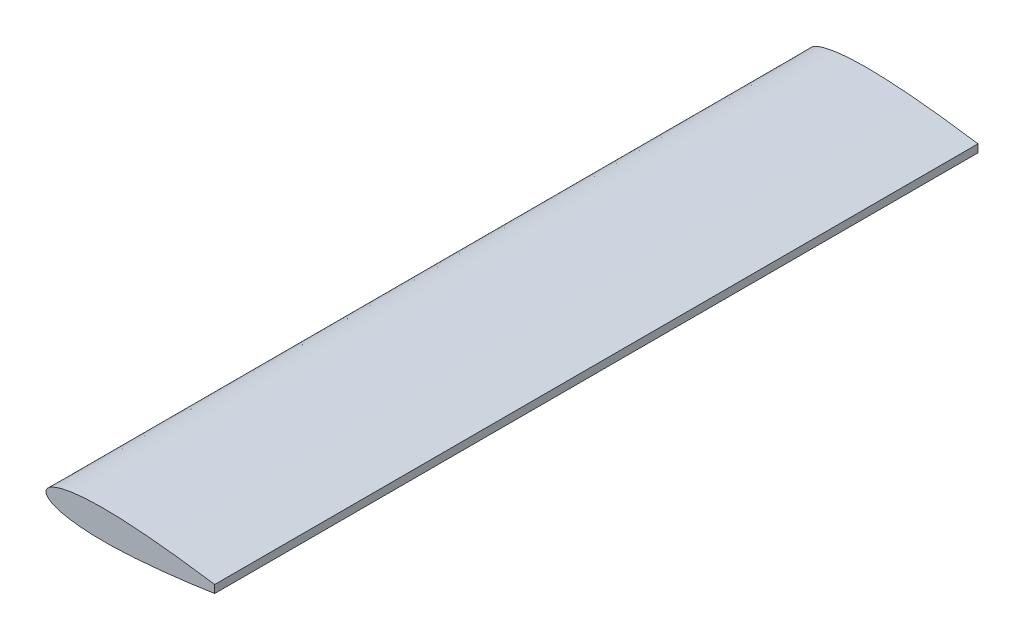
ISO-10303-21;
HEADER;
FILE_DESCRIPTION(('STEP AP214'),'2;1');
FILE_NAME('part.step','',(''),(''),'','','');
FILE_SCHEMA(('AUTOMOTIVE_DESIGN { 1 0 10303 214 1 1 1 1 }'));
ENDSEC;
DATA;
#1=APPLICATION_CONTEXT('core data for automotive mechanical design processes');
#2=APPLICATION_PROTOCOL_DEFINITION('international standard','automotive_design',2000,#1);
#3=PRODUCT_CONTEXT('',#1,'mechanical');
#4=PRODUCT('Part','Part','',(#3));
#5=PRODUCT_RELATED_PRODUCT_CATEGORY('part','',(#4));
#6=PRODUCT_DEFINITION_FORMATION('','',#4);
#7=PRODUCT_DEFINITION_CONTEXT('part definition',#1,'design');
#8=PRODUCT_DEFINITION('design','',#6,#7);
#9=PRODUCT_DEFINITION_SHAPE('','',#8);
#10=(LENGTH_UNIT() NAMED_UNIT(*) SI_UNIT(.MILLI.,.METRE.));
#11=(NAMED_UNIT(*) PLANE_ANGLE_UNIT() SI_UNIT($,.RADIAN.));
#12=(NAMED_UNIT(*) SI_UNIT($,.STERADIAN.) SOLID_ANGLE_UNIT());
#13=UNCERTAINTY_MEASURE_WITH_UNIT(LENGTH_MEASURE(1.E-05),#10,'distance_accuracy_value','');
#14=(GEOMETRIC_REPRESENTATION_CONTEXT(3) GLOBAL_UNCERTAINTY_ASSIGNED_CONTEXT((#13)) GLOBAL_UNIT_ASSIGNED_CONTEXT((#10,
#11,#12)) REPRESENTATION_CONTEXT('',''));
#15=CARTESIAN_POINT('',(0.,0.,0.));
#16=DIRECTION('',(0.,0.,1.));
#17=DIRECTION('',(1.,0.,0.));
#18=AXIS2_PLACEMENT_3D('',#15,#16,#17);
#19=CARTESIAN_POINT('',(87.3951206200439,0.235968611206823,302.));
#20=CARTESIAN_POINT('',(84.8959486887418,0.665928684584799,302.));
#21=CARTESIAN_POINT('',(79.9014599588763,1.52518559039502,302.));
#22=CARTESIAN_POINT('',(69.9066248700965,3.12260599284425,302.));
#23=CARTESIAN_POINT('',(57.4121462912735,4.95644683175647,302.));
#24=CARTESIAN_POINT('',(42.4108902125652,6.91018624900826,302.));
#25=CARTESIAN_POINT('',(27.4110875983502,8.60493051246451,302.));
#26=CARTESIAN_POINT('',(12.4111218015999,9.9900862046659,302.));
#27=CARTESIAN_POINT('',(-2.59122205177352,10.9741165457677,302.));
#28=CARTESIAN_POINT('',(-15.103442931041,11.3205115879112,302.));
#29=CARTESIAN_POINT('',(-25.1091053186778,11.1840759605762,302.));
#30=CARTESIAN_POINT('',(-32.6174923002774,10.8130196983056,302.));
#31=CARTESIAN_POINT('',(-40.1361668292086,10.0990192916365,302.));
#32=CARTESIAN_POINT('',(-46.395675990857,9.0993918778158,302.));
#33=CARTESIAN_POINT('',(-51.3947099630212,7.91075511271777,302.));
#34=CARTESIAN_POINT('',(-55.1903231052005,6.71878656562906,302.));
#35=CARTESIAN_POINT('',(-58.3812550074555,5.27210938350864,302.));
#36=CARTESIAN_POINT('',(-61.2455994913682,3.35780382880287,302.));
#37=CARTESIAN_POINT('',(-63.467561430567,-0.00103138879315032,302.));
#38=CARTESIAN_POINT('',(-61.2455994913682,-3.35986660638926,302.));
#39=CARTESIAN_POINT('',(-58.3812550074556,-5.27417216109497,302.));
#40=CARTESIAN_POINT('',(-55.1903231052005,-6.72084934321543,302.));
#41=CARTESIAN_POINT('',(-51.3947099630213,-7.91281789030411,302.));
#42=CARTESIAN_POINT('',(-46.395675990857,-9.10145465540217,302.));
#43=CARTESIAN_POINT('',(-40.1361668292086,-10.1010820692228,302.));
#44=CARTESIAN_POINT('',(-32.6174923002774,-10.8150824758919,302.));
#45=CARTESIAN_POINT('',(-25.1091053186778,-11.1861387381625,302.));
#46=CARTESIAN_POINT('',(-15.103442931041,-11.3225743654975,302.));
#47=CARTESIAN_POINT('',(-2.59122205177352,-10.976179323354,302.));
#48=CARTESIAN_POINT('',(12.4111218015999,-9.99214898225225,302.));
#49=CARTESIAN_POINT('',(27.4110875983503,-8.60699329005087,302.));
#50=CARTESIAN_POINT('',(42.4108902125652,-6.91224902659461,302.));
#51=CARTESIAN_POINT('',(57.4121462912735,-4.95850960934283,302.));
#52=CARTESIAN_POINT('',(69.9066248700965,-3.12466877043061,302.));
#53=CARTESIAN_POINT('',(79.9014599588764,-1.52724836798137,302.));
#54=CARTESIAN_POINT('',(84.8959486887418,-0.667991462171153,302.));
#55=CARTESIAN_POINT('',(87.3951206200439,-0.238031388793177,302.));
#56=B_SPLINE_CURVE_WITH_KNOTS('',3,(#19,#20,#21,#22,#23,#24,#25,#26,#27,#28,#29,#30,#31,#32,#33,
#34,#35,#36,#37,#38,#39,#40,#41,#42,#43,#44,#45,#46,#47,#48,#49,#50,#51,#52,#53,#54,#55),
.UNSPECIFIED.,.F.,.F.,(4,1,1,1,1,1,1,1,1,1,1,1,1,1,1,1,1,1,1,1,1,1,1,1,1,1,1,1,1,1,1,1,1,1,4),
(0.,0.0246840231451877,0.0493299696040297,0.0985220811790582,0.147602022491555,0.19657827575849,
0.245450479952564,0.294218900495614,0.342903642198885,0.367241268256885,0.391607783764362,
0.416059249203825,0.440726348791267,0.453242725185227,0.466028386782603,0.479472724477829,
0.486972137019317,0.5,0.513027862980683,0.520527275522171,0.533971613217397,0.546757274814773,
0.559273651208733,0.583940750796175,0.608392216235638,0.632758731743115,0.657096357801115,
0.705781099504386,0.754549520047436,0.803421724241509,0.852397977508445,0.901477918820942,
0.95067003039597,0.975315976854812,1.),.UNSPECIFIED.);
#57=DIRECTION('',(0.,0.,-1.));
#58=VECTOR('',#57,1.);
#59=SURFACE_OF_LINEAR_EXTRUSION('',#56,#58);
#60=DIRECTION('',(0.,0.,-1.));
#61=VECTOR('',#60,1.);
#62=CARTESIAN_POINT('',(70.,3.08299643423088,302.));
#63=LINE('',#62,#61);
#64=CARTESIAN_POINT('',(70.,3.08299643421603,-298.));
#65=VERTEX_POINT('',#64);
#66=CARTESIAN_POINT('',(70.,3.08299643423088,302.));
#67=VERTEX_POINT('',#66);
#68=EDGE_CURVE('E60',#65,#67,#63,.F.);
#69=ORIENTED_EDGE('',*,*,#68,.F.);
#70=CARTESIAN_POINT('',(87.3951206200439,0.235968611206823,-298.));
#71=CARTESIAN_POINT('',(84.8959486887418,0.665928684584799,-298.));
#72=CARTESIAN_POINT('',(79.9014599588763,1.52518559039502,-298.));
#73=CARTESIAN_POINT('',(69.9066248700965,3.12260599284425,-298.));
#74=CARTESIAN_POINT('',(57.4121462912735,4.95644683175647,-298.));
#75=CARTESIAN_POINT('',(42.4108902125652,6.91018624900826,-298.));
#76=CARTESIAN_POINT('',(27.4110875983502,8.60493051246451,-298.));
#77=CARTESIAN_POINT('',(12.4111218015999,9.9900862046659,-298.));
#78=CARTESIAN_POINT('',(-2.59122205177352,10.9741165457677,-298.));
#79=CARTESIAN_POINT('',(-15.103442931041,11.3205115879112,-298.));
#80=CARTESIAN_POINT('',(-25.1091053186778,11.1840759605762,-298.));
#81=CARTESIAN_POINT('',(-32.6174923002774,10.8130196983056,-298.));
#82=CARTESIAN_POINT('',(-40.1361668292086,10.0990192916365,-298.));
#83=CARTESIAN_POINT('',(-46.395675990857,9.0993918778158,-298.));
#84=CARTESIAN_POINT('',(-51.3947099630212,7.91075511271777,-298.));
#85=CARTESIAN_POINT('',(-55.1903231052005,6.71878656562906,-298.));
#86=CARTESIAN_POINT('',(-58.3812550074555,5.27210938350864,-298.));
#87=CARTESIAN_POINT('',(-61.2455994913682,3.35780382880287,-298.));
#88=CARTESIAN_POINT('',(-63.467561430567,-0.00103138879315032,-298.));
#89=CARTESIAN_POINT('',(-61.2455994913682,-3.35986660638926,-298.));
#90=CARTESIAN_POINT('',(-58.3812550074556,-5.27417216109497,-298.));
#91=CARTESIAN_POINT('',(-55.1903231052005,-6.72084934321543,-298.));
#92=CARTESIAN_POINT('',(-51.3947099630213,-7.91281789030411,-298.));
#93=CARTESIAN_POINT('',(-46.395675990857,-9.10145465540217,-298.));
#94=CARTESIAN_POINT('',(-40.1361668292086,-10.1010820692228,-298.));
#95=CARTESIAN_POINT('',(-32.6174923002774,-10.8150824758919,-298.));
#96=CARTESIAN_POINT('',(-25.1091053186778,-11.1861387381625,-298.));
#97=CARTESIAN_POINT('',(-15.103442931041,-11.3225743654975,-298.));
#98=CARTESIAN_POINT('',(-2.59122205177352,-10.976179323354,-298.));
#99=CARTESIAN_POINT('',(12.4111218015999,-9.99214898225225,-298.));
#100=CARTESIAN_POINT('',(27.4110875983503,-8.60699329005087,-298.));
#101=CARTESIAN_POINT('',(42.4108902125652,-6.91224902659461,-298.));
#102=CARTESIAN_POINT('',(57.4121462912735,-4.95850960934283,-298.));
#103=CARTESIAN_POINT('',(69.9066248700965,-3.12466877043061,-298.));
#104=CARTESIAN_POINT('',(79.9014599588764,-1.52724836798137,-298.));
#105=CARTESIAN_POINT('',(84.8959486887418,-0.667991462171153,-298.));
#106=CARTESIAN_POINT('',(87.3951206200439,-0.238031388793177,-298.));
#107=B_SPLINE_CURVE_WITH_KNOTS('',3,(#70,#71,#72,#73,#74,#75,#76,#77,#78,#79,#80,#81,#82,#83,
#84,#85,#86,#87,#88,#89,#90,#91,#92,#93,#94,#95,#96,#97,#98,#99,#100,#101,#102,#103,#104,#105,
#106),.UNSPECIFIED.,.F.,.F.,(4,1,1,1,1,1,1,1,1,1,1,1,1,1,1,1,1,1,1,1,1,1,1,1,1,1,1,1,1,1,1,1,1,
1,4),(0.,0.0246840231451877,0.0493299696040297,0.0985220811790582,0.147602022491555,
0.19657827575849,0.245450479952564,0.294218900495614,0.342903642198885,0.367241268256885,
0.391607783764362,0.416059249203825,0.440726348791267,0.453242725185227,0.466028386782603,
0.479472724477829,0.486972137019317,0.5,0.513027862980683,0.520527275522171,0.533971613217397,
0.546757274814773,0.559273651208733,0.583940750796175,0.608392216235638,0.632758731743115,
0.657096357801115,0.705781099504386,0.754549520047436,0.803421724241509,0.852397977508445,
0.901477918820942,0.95067003039597,0.975315976854812,1.),.UNSPECIFIED.);
#108=CARTESIAN_POINT('',(70.0000000000972,-3.08505921180239,-298.));
#109=VERTEX_POINT('',#108);
#110=EDGE_CURVE('E71',#65,#109,#107,.T.);
#111=ORIENTED_EDGE('',*,*,#110,.T.);
#112=DIRECTION('',(0.,0.,-1.));
#113=VECTOR('',#112,1.);
#114=CARTESIAN_POINT('',(70.,-3.08505921181724,302.));
#115=LINE('',#114,#113);
#116=CARTESIAN_POINT('',(70.,-3.08505921181724,302.));
#117=VERTEX_POINT('',#116);
#118=EDGE_CURVE('E56',#117,#109,#115,.T.);
#119=ORIENTED_EDGE('',*,*,#118,.F.);
#120=EDGE_CURVE('E49',#67,#117,#56,.T.);
#121=ORIENTED_EDGE('',*,*,#120,.F.);
#122=EDGE_LOOP('',(#69,#111,#119,#121));
#123=FACE_BOUND('',#122,.T.);
#124=ADVANCED_FACE('F41',(#123),#59,.F.);
#125=CARTESIAN_POINT('',(-62.6048793799561,-0.00103138879317672,302.));
#126=DIRECTION('',(0.,0.,-1.));
#127=DIRECTION('',(-1.,0.,0.));
#128=AXIS2_PLACEMENT_3D('',#125,#126,#127);
#129=PLANE('',#128);
#130=DIRECTION('',(0.,-1.,0.));
#131=VECTOR('',#130,1.);
#132=CARTESIAN_POINT('',(70.,-0.00103138879317672,302.));
#133=LINE('',#132,#131);
#134=EDGE_CURVE('E73',#67,#117,#133,.T.);
#135=ORIENTED_EDGE('',*,*,#134,.F.);
#136=ORIENTED_EDGE('',*,*,#120,.T.);
#137=EDGE_LOOP('',(#135,#136));
#138=FACE_BOUND('',#137,.T.);
#139=ADVANCED_FACE('F90',(#138),#129,.F.);
#140=CARTESIAN_POINT('',(-62.6048793799561,-0.00103138879317672,-298.));
#141=DIRECTION('',(0.,0.,-1.));
#142=DIRECTION('',(-1.,0.,0.));
#143=AXIS2_PLACEMENT_3D('',#140,#141,#142);
#144=PLANE('',#143);
#145=ORIENTED_EDGE('',*,*,#110,.F.);
#146=DIRECTION('',(0.,-1.,0.));
#147=VECTOR('',#146,1.);
#148=CARTESIAN_POINT('',(70.,-0.00103138879317672,-298.));
#149=LINE('',#148,#147);
#150=EDGE_CURVE('E11',#65,#109,#149,.T.);
#151=ORIENTED_EDGE('',*,*,#150,.T.);
#152=EDGE_LOOP('',(#145,#151));
#153=FACE_BOUND('',#152,.T.);
#154=ADVANCED_FACE('F75',(#153),#144,.T.);
#155=CARTESIAN_POINT('',(70.,-15.9395390527005,334.));
#156=DIRECTION('',(1.,0.,0.));
#157=DIRECTION('',(0.,0.,-1.));
#158=AXIS2_PLACEMENT_3D('',#155,#156,#157);
#159=PLANE('',#158);
#160=ORIENTED_EDGE('',*,*,#134,.T.);
#161=ORIENTED_EDGE('',*,*,#118,.T.);
#162=ORIENTED_EDGE('',*,*,#150,.F.);
#163=ORIENTED_EDGE('',*,*,#68,.T.);
#164=EDGE_LOOP('',(#160,#161,#162,#163));
#165=FACE_BOUND('',#164,.T.);
#166=ADVANCED_FACE('F65',(#165),#159,.T.);
#167=CLOSED_SHELL('',(#124,#139,#154,#166));
#168=MANIFOLD_SOLID_BREP('B2',#167);
#169=ADVANCED_BREP_SHAPE_REPRESENTATION('',(#18,#168),#14);
#170=SHAPE_DEFINITION_REPRESENTATION(#9,#169);
ENDSEC;
END-ISO-10303-21;
